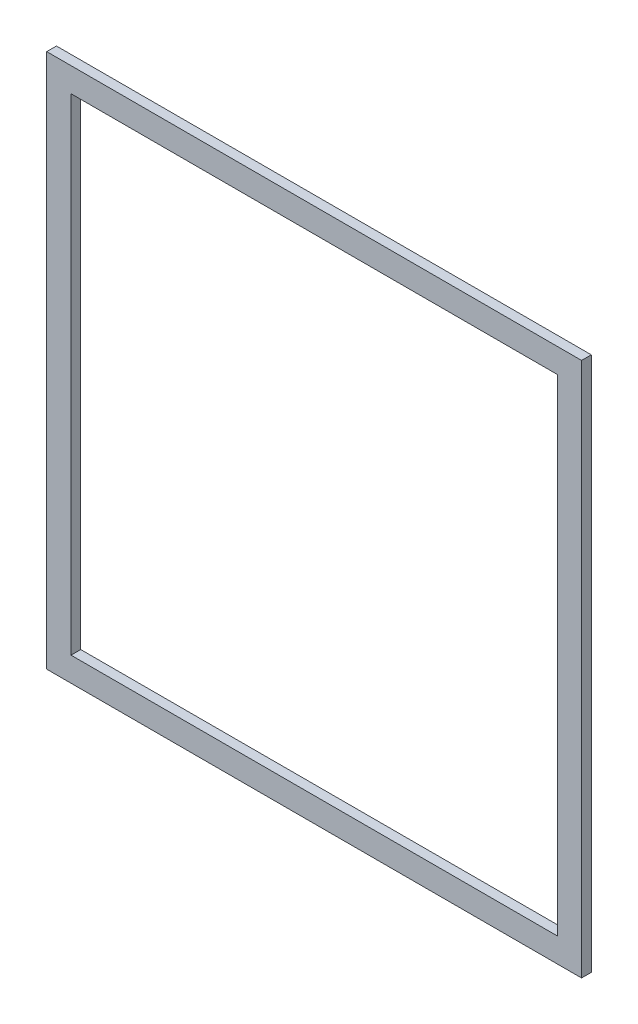
ISO-10303-21;
HEADER;
FILE_DESCRIPTION(('STEP AP214'),'2;1');
FILE_NAME('part.step','',(''),(''),'','','');
FILE_SCHEMA(('AUTOMOTIVE_DESIGN { 1 0 10303 214 1 1 1 1 }'));
ENDSEC;
DATA;
#1=APPLICATION_CONTEXT('core data for automotive mechanical design processes');
#2=APPLICATION_PROTOCOL_DEFINITION('international standard','automotive_design',2000,#1);
#3=PRODUCT_CONTEXT('',#1,'mechanical');
#4=PRODUCT('Part','Part','',(#3));
#5=PRODUCT_RELATED_PRODUCT_CATEGORY('part','',(#4));
#6=PRODUCT_DEFINITION_FORMATION('','',#4);
#7=PRODUCT_DEFINITION_CONTEXT('part definition',#1,'design');
#8=PRODUCT_DEFINITION('design','',#6,#7);
#9=PRODUCT_DEFINITION_SHAPE('','',#8);
#10=(LENGTH_UNIT() NAMED_UNIT(*) SI_UNIT(.MILLI.,.METRE.));
#11=(NAMED_UNIT(*) PLANE_ANGLE_UNIT() SI_UNIT($,.RADIAN.));
#12=(NAMED_UNIT(*) SI_UNIT($,.STERADIAN.) SOLID_ANGLE_UNIT());
#13=UNCERTAINTY_MEASURE_WITH_UNIT(LENGTH_MEASURE(1.E-05),#10,'distance_accuracy_value','');
#14=(GEOMETRIC_REPRESENTATION_CONTEXT(3) GLOBAL_UNCERTAINTY_ASSIGNED_CONTEXT((#13)) GLOBAL_UNIT_ASSIGNED_CONTEXT((#10,
#11,#12)) REPRESENTATION_CONTEXT('',''));
#15=CARTESIAN_POINT('',(0.,0.,0.));
#16=DIRECTION('',(0.,0.,1.));
#17=DIRECTION('',(1.,0.,0.));
#18=AXIS2_PLACEMENT_3D('',#15,#16,#17);
#19=CARTESIAN_POINT('',(0.,0.,10.));
#20=DIRECTION('',(0.,0.,-1.));
#21=DIRECTION('',(-1.,0.,0.));
#22=AXIS2_PLACEMENT_3D('',#19,#20,#21);
#23=PLANE('',#22);
#24=DIRECTION('',(0.,1.,0.));
#25=VECTOR('',#24,1.);
#26=CARTESIAN_POINT('',(275.,275.,10.));
#27=LINE('',#26,#25);
#28=CARTESIAN_POINT('',(275.,-275.,10.));
#29=VERTEX_POINT('',#28);
#30=CARTESIAN_POINT('',(275.,275.,10.));
#31=VERTEX_POINT('',#30);
#32=EDGE_CURVE('E133',#29,#31,#27,.T.);
#33=ORIENTED_EDGE('',*,*,#32,.T.);
#34=DIRECTION('',(-1.,0.,0.));
#35=VECTOR('',#34,1.);
#36=CARTESIAN_POINT('',(275.,275.,10.));
#37=LINE('',#36,#35);
#38=CARTESIAN_POINT('',(-275.,275.,10.));
#39=VERTEX_POINT('',#38);
#40=EDGE_CURVE('E136',#31,#39,#37,.T.);
#41=ORIENTED_EDGE('',*,*,#40,.T.);
#42=DIRECTION('',(0.,-1.,0.));
#43=VECTOR('',#42,1.);
#44=CARTESIAN_POINT('',(-275.,275.,10.));
#45=LINE('',#44,#43);
#46=CARTESIAN_POINT('',(-275.,-275.,10.));
#47=VERTEX_POINT('',#46);
#48=EDGE_CURVE('E139',#39,#47,#45,.T.);
#49=ORIENTED_EDGE('',*,*,#48,.T.);
#50=DIRECTION('',(1.,0.,0.));
#51=VECTOR('',#50,1.);
#52=CARTESIAN_POINT('',(275.,-275.,10.));
#53=LINE('',#52,#51);
#54=EDGE_CURVE('E141',#47,#29,#53,.T.);
#55=ORIENTED_EDGE('',*,*,#54,.T.);
#56=EDGE_LOOP('',(#33,#41,#49,#55));
#57=FACE_BOUND('',#56,.T.);
#58=DIRECTION('',(0.,-1.,0.));
#59=VECTOR('',#58,1.);
#60=CARTESIAN_POINT('',(-250.,-250.,10.));
#61=LINE('',#60,#59);
#62=CARTESIAN_POINT('',(-250.,250.,10.));
#63=VERTEX_POINT('',#62);
#64=CARTESIAN_POINT('',(-250.,-250.,10.));
#65=VERTEX_POINT('',#64);
#66=EDGE_CURVE('E97',#63,#65,#61,.T.);
#67=ORIENTED_EDGE('',*,*,#66,.F.);
#68=DIRECTION('',(-1.,0.,0.));
#69=VECTOR('',#68,1.);
#70=CARTESIAN_POINT('',(-250.,250.,10.));
#71=LINE('',#70,#69);
#72=CARTESIAN_POINT('',(250.,250.,10.));
#73=VERTEX_POINT('',#72);
#74=EDGE_CURVE('E119',#73,#63,#71,.T.);
#75=ORIENTED_EDGE('',*,*,#74,.F.);
#76=DIRECTION('',(0.,1.,0.));
#77=VECTOR('',#76,1.);
#78=CARTESIAN_POINT('',(250.,-250.,10.));
#79=LINE('',#78,#77);
#80=CARTESIAN_POINT('',(250.,-250.,10.));
#81=VERTEX_POINT('',#80);
#82=EDGE_CURVE('E117',#81,#73,#79,.T.);
#83=ORIENTED_EDGE('',*,*,#82,.F.);
#84=DIRECTION('',(1.,0.,0.));
#85=VECTOR('',#84,1.);
#86=CARTESIAN_POINT('',(-250.,-250.,10.));
#87=LINE('',#86,#85);
#88=EDGE_CURVE('E105',#65,#81,#87,.T.);
#89=ORIENTED_EDGE('',*,*,#88,.F.);
#90=EDGE_LOOP('',(#67,#75,#83,#89));
#91=FACE_BOUND('',#90,.T.);
#92=ADVANCED_FACE('F32',(#57,#91),#23,.F.);
#93=CARTESIAN_POINT('',(0.,0.,0.));
#94=DIRECTION('',(0.,0.,-1.));
#95=DIRECTION('',(-1.,0.,0.));
#96=AXIS2_PLACEMENT_3D('',#93,#94,#95);
#97=PLANE('',#96);
#98=DIRECTION('',(0.,1.,0.));
#99=VECTOR('',#98,1.);
#100=CARTESIAN_POINT('',(275.,275.,0.));
#101=LINE('',#100,#99);
#102=CARTESIAN_POINT('',(275.,-275.,0.));
#103=VERTEX_POINT('',#102);
#104=CARTESIAN_POINT('',(275.,275.,0.));
#105=VERTEX_POINT('',#104);
#106=EDGE_CURVE('E113',#103,#105,#101,.T.);
#107=ORIENTED_EDGE('',*,*,#106,.F.);
#108=DIRECTION('',(1.,0.,0.));
#109=VECTOR('',#108,1.);
#110=CARTESIAN_POINT('',(275.,-275.,0.));
#111=LINE('',#110,#109);
#112=CARTESIAN_POINT('',(-275.,-275.,0.));
#113=VERTEX_POINT('',#112);
#114=EDGE_CURVE('E137',#113,#103,#111,.T.);
#115=ORIENTED_EDGE('',*,*,#114,.F.);
#116=DIRECTION('',(0.,-1.,0.));
#117=VECTOR('',#116,1.);
#118=CARTESIAN_POINT('',(-275.,275.,0.));
#119=LINE('',#118,#117);
#120=CARTESIAN_POINT('',(-275.,275.,0.));
#121=VERTEX_POINT('',#120);
#122=EDGE_CURVE('E148',#121,#113,#119,.T.);
#123=ORIENTED_EDGE('',*,*,#122,.F.);
#124=DIRECTION('',(-1.,0.,0.));
#125=VECTOR('',#124,1.);
#126=CARTESIAN_POINT('',(275.,275.,0.));
#127=LINE('',#126,#125);
#128=EDGE_CURVE('E146',#105,#121,#127,.T.);
#129=ORIENTED_EDGE('',*,*,#128,.F.);
#130=EDGE_LOOP('',(#107,#115,#123,#129));
#131=FACE_BOUND('',#130,.T.);
#132=DIRECTION('',(-1.,0.,0.));
#133=VECTOR('',#132,1.);
#134=CARTESIAN_POINT('',(-250.,250.,0.));
#135=LINE('',#134,#133);
#136=CARTESIAN_POINT('',(250.,250.,0.));
#137=VERTEX_POINT('',#136);
#138=CARTESIAN_POINT('',(-250.,250.,0.));
#139=VERTEX_POINT('',#138);
#140=EDGE_CURVE('E106',#137,#139,#135,.T.);
#141=ORIENTED_EDGE('',*,*,#140,.T.);
#142=DIRECTION('',(0.,-1.,0.));
#143=VECTOR('',#142,1.);
#144=CARTESIAN_POINT('',(-250.,-250.,0.));
#145=LINE('',#144,#143);
#146=CARTESIAN_POINT('',(-250.,-250.,0.));
#147=VERTEX_POINT('',#146);
#148=EDGE_CURVE('E55',#139,#147,#145,.T.);
#149=ORIENTED_EDGE('',*,*,#148,.T.);
#150=DIRECTION('',(1.,0.,0.));
#151=VECTOR('',#150,1.);
#152=CARTESIAN_POINT('',(-250.,-250.,0.));
#153=LINE('',#152,#151);
#154=CARTESIAN_POINT('',(250.,-250.,0.));
#155=VERTEX_POINT('',#154);
#156=EDGE_CURVE('E112',#147,#155,#153,.T.);
#157=ORIENTED_EDGE('',*,*,#156,.T.);
#158=DIRECTION('',(0.,1.,0.));
#159=VECTOR('',#158,1.);
#160=CARTESIAN_POINT('',(250.,-250.,0.));
#161=LINE('',#160,#159);
#162=EDGE_CURVE('E125',#155,#137,#161,.T.);
#163=ORIENTED_EDGE('',*,*,#162,.T.);
#164=EDGE_LOOP('',(#141,#149,#157,#163));
#165=FACE_BOUND('',#164,.T.);
#166=ADVANCED_FACE('F166',(#131,#165),#97,.T.);
#167=CARTESIAN_POINT('',(275.,275.,10.));
#168=DIRECTION('',(-1.,0.,0.));
#169=DIRECTION('',(0.,0.,1.));
#170=AXIS2_PLACEMENT_3D('',#167,#168,#169);
#171=PLANE('',#170);
#172=ORIENTED_EDGE('',*,*,#106,.T.);
#173=DIRECTION('',(0.,0.,-1.));
#174=VECTOR('',#173,1.);
#175=CARTESIAN_POINT('',(275.,275.,10.));
#176=LINE('',#175,#174);
#177=EDGE_CURVE('E11',#31,#105,#176,.T.);
#178=ORIENTED_EDGE('',*,*,#177,.F.);
#179=ORIENTED_EDGE('',*,*,#32,.F.);
#180=DIRECTION('',(0.,0.,-1.));
#181=VECTOR('',#180,1.);
#182=CARTESIAN_POINT('',(275.,-275.,10.));
#183=LINE('',#182,#181);
#184=EDGE_CURVE('E143',#29,#103,#183,.T.);
#185=ORIENTED_EDGE('',*,*,#184,.T.);
#186=EDGE_LOOP('',(#172,#178,#179,#185));
#187=FACE_BOUND('',#186,.T.);
#188=ADVANCED_FACE('F34',(#187),#171,.F.);
#189=CARTESIAN_POINT('',(275.,275.,10.));
#190=DIRECTION('',(0.,-1.,0.));
#191=DIRECTION('',(0.,0.,-1.));
#192=AXIS2_PLACEMENT_3D('',#189,#190,#191);
#193=PLANE('',#192);
#194=ORIENTED_EDGE('',*,*,#128,.T.);
#195=DIRECTION('',(0.,0.,-1.));
#196=VECTOR('',#195,1.);
#197=CARTESIAN_POINT('',(-275.,275.,10.));
#198=LINE('',#197,#196);
#199=EDGE_CURVE('E40',#39,#121,#198,.T.);
#200=ORIENTED_EDGE('',*,*,#199,.F.);
#201=ORIENTED_EDGE('',*,*,#40,.F.);
#202=ORIENTED_EDGE('',*,*,#177,.T.);
#203=EDGE_LOOP('',(#194,#200,#201,#202));
#204=FACE_BOUND('',#203,.T.);
#205=ADVANCED_FACE('F176',(#204),#193,.F.);
#206=CARTESIAN_POINT('',(-275.,275.,10.));
#207=DIRECTION('',(1.,0.,0.));
#208=DIRECTION('',(0.,0.,-1.));
#209=AXIS2_PLACEMENT_3D('',#206,#207,#208);
#210=PLANE('',#209);
#211=ORIENTED_EDGE('',*,*,#122,.T.);
#212=DIRECTION('',(0.,0.,-1.));
#213=VECTOR('',#212,1.);
#214=CARTESIAN_POINT('',(-275.,-275.,10.));
#215=LINE('',#214,#213);
#216=EDGE_CURVE('E153',#47,#113,#215,.T.);
#217=ORIENTED_EDGE('',*,*,#216,.F.);
#218=ORIENTED_EDGE('',*,*,#48,.F.);
#219=ORIENTED_EDGE('',*,*,#199,.T.);
#220=EDGE_LOOP('',(#211,#217,#218,#219));
#221=FACE_BOUND('',#220,.T.);
#222=ADVANCED_FACE('F160',(#221),#210,.F.);
#223=CARTESIAN_POINT('',(275.,-275.,10.));
#224=DIRECTION('',(0.,1.,0.));
#225=DIRECTION('',(0.,0.,1.));
#226=AXIS2_PLACEMENT_3D('',#223,#224,#225);
#227=PLANE('',#226);
#228=ORIENTED_EDGE('',*,*,#114,.T.);
#229=ORIENTED_EDGE('',*,*,#184,.F.);
#230=ORIENTED_EDGE('',*,*,#54,.F.);
#231=ORIENTED_EDGE('',*,*,#216,.T.);
#232=EDGE_LOOP('',(#228,#229,#230,#231));
#233=FACE_BOUND('',#232,.T.);
#234=ADVANCED_FACE('F170',(#233),#227,.F.);
#235=CARTESIAN_POINT('',(-250.,-250.,10.));
#236=DIRECTION('',(1.,0.,0.));
#237=DIRECTION('',(0.,0.,-1.));
#238=AXIS2_PLACEMENT_3D('',#235,#236,#237);
#239=PLANE('',#238);
#240=ORIENTED_EDGE('',*,*,#148,.F.);
#241=DIRECTION('',(0.,0.,-1.));
#242=VECTOR('',#241,1.);
#243=CARTESIAN_POINT('',(-250.,250.,10.));
#244=LINE('',#243,#242);
#245=EDGE_CURVE('E101',#63,#139,#244,.T.);
#246=ORIENTED_EDGE('',*,*,#245,.F.);
#247=ORIENTED_EDGE('',*,*,#66,.T.);
#248=DIRECTION('',(0.,0.,-1.));
#249=VECTOR('',#248,1.);
#250=CARTESIAN_POINT('',(-250.,-250.,10.));
#251=LINE('',#250,#249);
#252=EDGE_CURVE('E100',#65,#147,#251,.T.);
#253=ORIENTED_EDGE('',*,*,#252,.T.);
#254=EDGE_LOOP('',(#240,#246,#247,#253));
#255=FACE_BOUND('',#254,.T.);
#256=ADVANCED_FACE('F99',(#255),#239,.T.);
#257=CARTESIAN_POINT('',(-250.,-250.,10.));
#258=DIRECTION('',(0.,1.,0.));
#259=DIRECTION('',(0.,0.,1.));
#260=AXIS2_PLACEMENT_3D('',#257,#258,#259);
#261=PLANE('',#260);
#262=ORIENTED_EDGE('',*,*,#156,.F.);
#263=ORIENTED_EDGE('',*,*,#252,.F.);
#264=ORIENTED_EDGE('',*,*,#88,.T.);
#265=DIRECTION('',(0.,0.,-1.));
#266=VECTOR('',#265,1.);
#267=CARTESIAN_POINT('',(250.,-250.,10.));
#268=LINE('',#267,#266);
#269=EDGE_CURVE('E114',#81,#155,#268,.T.);
#270=ORIENTED_EDGE('',*,*,#269,.T.);
#271=EDGE_LOOP('',(#262,#263,#264,#270));
#272=FACE_BOUND('',#271,.T.);
#273=ADVANCED_FACE('F109',(#272),#261,.T.);
#274=CARTESIAN_POINT('',(250.,-250.,10.));
#275=DIRECTION('',(-1.,0.,0.));
#276=DIRECTION('',(0.,0.,1.));
#277=AXIS2_PLACEMENT_3D('',#274,#275,#276);
#278=PLANE('',#277);
#279=ORIENTED_EDGE('',*,*,#162,.F.);
#280=ORIENTED_EDGE('',*,*,#269,.F.);
#281=ORIENTED_EDGE('',*,*,#82,.T.);
#282=DIRECTION('',(0.,0.,-1.));
#283=VECTOR('',#282,1.);
#284=CARTESIAN_POINT('',(250.,250.,10.));
#285=LINE('',#284,#283);
#286=EDGE_CURVE('E47',#73,#137,#285,.T.);
#287=ORIENTED_EDGE('',*,*,#286,.T.);
#288=EDGE_LOOP('',(#279,#280,#281,#287));
#289=FACE_BOUND('',#288,.T.);
#290=ADVANCED_FACE('F199',(#289),#278,.T.);
#291=CARTESIAN_POINT('',(-250.,250.,10.));
#292=DIRECTION('',(0.,-1.,0.));
#293=DIRECTION('',(1.,0.,0.));
#294=AXIS2_PLACEMENT_3D('',#291,#292,#293);
#295=PLANE('',#294);
#296=ORIENTED_EDGE('',*,*,#140,.F.);
#297=ORIENTED_EDGE('',*,*,#286,.F.);
#298=ORIENTED_EDGE('',*,*,#74,.T.);
#299=ORIENTED_EDGE('',*,*,#245,.T.);
#300=EDGE_LOOP('',(#296,#297,#298,#299));
#301=FACE_BOUND('',#300,.T.);
#302=ADVANCED_FACE('F203',(#301),#295,.T.);
#303=CLOSED_SHELL('',(#92,#166,#188,#205,#222,#234,#256,#273,#290,#302));
#304=MANIFOLD_SOLID_BREP('B2',#303);
#305=ADVANCED_BREP_SHAPE_REPRESENTATION('',(#18,#304),#14);
#306=SHAPE_DEFINITION_REPRESENTATION(#9,#305);
ENDSEC;
END-ISO-10303-21;
